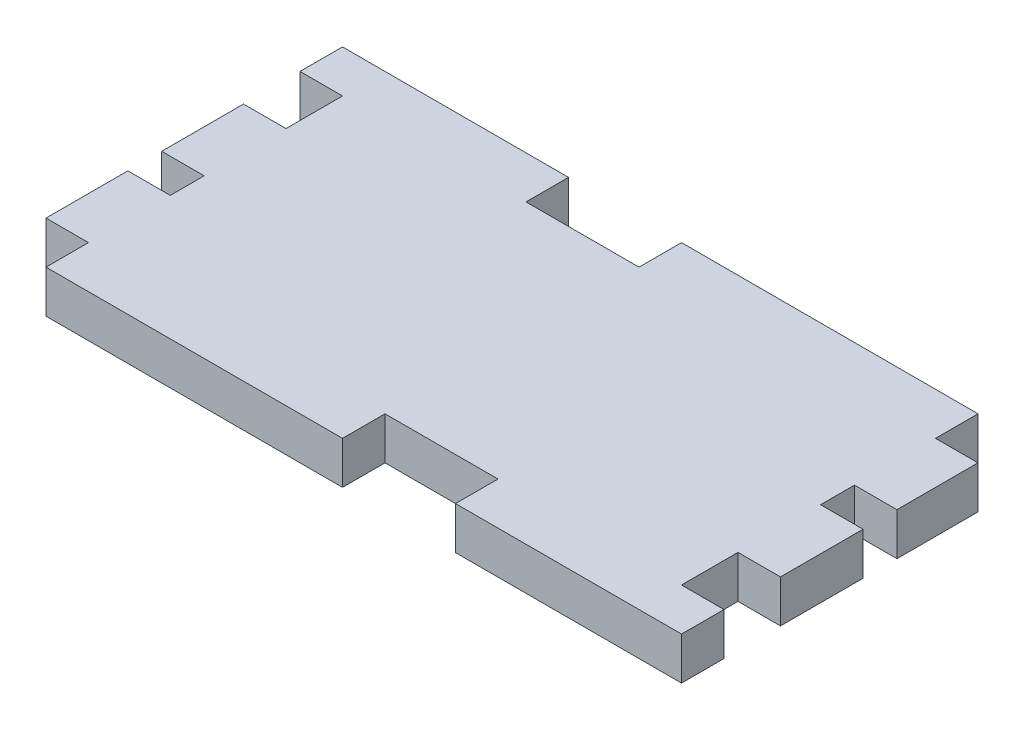
ISO-10303-21;
HEADER;
FILE_DESCRIPTION(('STEP AP214'),'2;1');
FILE_NAME('part.step','',(''),(''),'','','');
FILE_SCHEMA(('AUTOMOTIVE_DESIGN { 1 0 10303 214 1 1 1 1 }'));
ENDSEC;
DATA;
#1=APPLICATION_CONTEXT('core data for automotive mechanical design processes');
#2=APPLICATION_PROTOCOL_DEFINITION('international standard','automotive_design',2000,#1);
#3=PRODUCT_CONTEXT('',#1,'mechanical');
#4=PRODUCT('Part','Part','',(#3));
#5=PRODUCT_RELATED_PRODUCT_CATEGORY('part','',(#4));
#6=PRODUCT_DEFINITION_FORMATION('','',#4);
#7=PRODUCT_DEFINITION_CONTEXT('part definition',#1,'design');
#8=PRODUCT_DEFINITION('design','',#6,#7);
#9=PRODUCT_DEFINITION_SHAPE('','',#8);
#10=(LENGTH_UNIT() NAMED_UNIT(*) SI_UNIT(.MILLI.,.METRE.));
#11=(NAMED_UNIT(*) PLANE_ANGLE_UNIT() SI_UNIT($,.RADIAN.));
#12=(NAMED_UNIT(*) SI_UNIT($,.STERADIAN.) SOLID_ANGLE_UNIT());
#13=UNCERTAINTY_MEASURE_WITH_UNIT(LENGTH_MEASURE(1.E-05),#10,'distance_accuracy_value','');
#14=(GEOMETRIC_REPRESENTATION_CONTEXT(3) GLOBAL_UNCERTAINTY_ASSIGNED_CONTEXT((#13)) GLOBAL_UNIT_ASSIGNED_CONTEXT((#10,
#11,#12)) REPRESENTATION_CONTEXT('',''));
#15=CARTESIAN_POINT('',(0.,0.,0.));
#16=DIRECTION('',(0.,0.,1.));
#17=DIRECTION('',(1.,0.,0.));
#18=AXIS2_PLACEMENT_3D('',#15,#16,#17);
#19=CARTESIAN_POINT('',(38.1,4.7752,19.05));
#20=DIRECTION('',(-1.,0.,0.));
#21=DIRECTION('',(0.,0.,1.));
#22=AXIS2_PLACEMENT_3D('',#19,#20,#21);
#23=PLANE('',#22);
#24=DIRECTION('',(0.,0.,-1.));
#25=VECTOR('',#24,1.);
#26=CARTESIAN_POINT('',(38.1,0.,19.05));
#27=LINE('',#26,#25);
#28=CARTESIAN_POINT('',(38.1,0.,19.05));
#29=VERTEX_POINT('',#28);
#30=CARTESIAN_POINT('',(38.1,0.,14.2748));
#31=VERTEX_POINT('',#30);
#32=EDGE_CURVE('E293',#29,#31,#27,.T.);
#33=ORIENTED_EDGE('',*,*,#32,.T.);
#34=DIRECTION('',(0.,1.,0.));
#35=VECTOR('',#34,1.);
#36=CARTESIAN_POINT('',(38.1,-1.5748,14.2748));
#37=LINE('',#36,#35);
#38=CARTESIAN_POINT('',(38.1,4.7752,14.2748));
#39=VERTEX_POINT('',#38);
#40=EDGE_CURVE('E411',#31,#39,#37,.T.);
#41=ORIENTED_EDGE('',*,*,#40,.T.);
#42=DIRECTION('',(0.,0.,-1.));
#43=VECTOR('',#42,1.);
#44=CARTESIAN_POINT('',(38.1,4.7752,19.05));
#45=LINE('',#44,#43);
#46=CARTESIAN_POINT('',(38.1,4.7752,19.05));
#47=VERTEX_POINT('',#46);
#48=EDGE_CURVE('E285',#47,#39,#45,.T.);
#49=ORIENTED_EDGE('',*,*,#48,.F.);
#50=DIRECTION('',(0.,-1.,0.));
#51=VECTOR('',#50,1.);
#52=CARTESIAN_POINT('',(38.1,4.7752,19.05));
#53=LINE('',#52,#51);
#54=EDGE_CURVE('E309',#47,#29,#53,.T.);
#55=ORIENTED_EDGE('',*,*,#54,.T.);
#56=EDGE_LOOP('',(#33,#41,#49,#55));
#57=FACE_BOUND('',#56,.T.);
#58=ADVANCED_FACE('F43',(#57),#23,.F.);
#59=CARTESIAN_POINT('',(38.1,0.,-5.16420071734586));
#60=VERTEX_POINT('',#59);
#61=CARTESIAN_POINT('',(38.1,0.,-14.2748));
#62=VERTEX_POINT('',#61);
#63=EDGE_CURVE('E298',#60,#62,#27,.T.);
#64=ORIENTED_EDGE('',*,*,#63,.T.);
#65=DIRECTION('',(0.,1.,0.));
#66=VECTOR('',#65,1.);
#67=CARTESIAN_POINT('',(38.1,-1.5748,-14.2748));
#68=LINE('',#67,#66);
#69=CARTESIAN_POINT('',(38.1,4.7752,-14.2748));
#70=VERTEX_POINT('',#69);
#71=EDGE_CURVE('E263',#62,#70,#68,.T.);
#72=ORIENTED_EDGE('',*,*,#71,.T.);
#73=CARTESIAN_POINT('',(38.1,4.7752,-5.16420071734586));
#74=VERTEX_POINT('',#73);
#75=EDGE_CURVE('E576',#74,#70,#45,.T.);
#76=ORIENTED_EDGE('',*,*,#75,.F.);
#77=DIRECTION('',(0.,1.,0.));
#78=VECTOR('',#77,1.);
#79=CARTESIAN_POINT('',(38.1,-1.5748,-5.16420071734586));
#80=LINE('',#79,#78);
#81=EDGE_CURVE('E482',#60,#74,#80,.T.);
#82=ORIENTED_EDGE('',*,*,#81,.F.);
#83=EDGE_LOOP('',(#64,#72,#76,#82));
#84=FACE_BOUND('',#83,.T.);
#85=ADVANCED_FACE('F554',(#84),#23,.F.);
#86=CARTESIAN_POINT('',(-38.1,4.7752,-19.05));
#87=DIRECTION('',(0.,0.,1.));
#88=DIRECTION('',(1.,0.,0.));
#89=AXIS2_PLACEMENT_3D('',#86,#87,#88);
#90=PLANE('',#89);
#91=DIRECTION('',(-1.,0.,0.));
#92=VECTOR('',#91,1.);
#93=CARTESIAN_POINT('',(-38.1,0.,-19.05));
#94=LINE('',#93,#92);
#95=CARTESIAN_POINT('',(33.3248,0.,-19.05));
#96=VERTEX_POINT('',#95);
#97=CARTESIAN_POINT('',(0.,0.,-19.05));
#98=VERTEX_POINT('',#97);
#99=EDGE_CURVE('E300',#96,#98,#94,.T.);
#100=ORIENTED_EDGE('',*,*,#99,.T.);
#101=DIRECTION('',(0.,1.,0.));
#102=VECTOR('',#101,1.);
#103=CARTESIAN_POINT('',(0.,-1.5748,-19.05));
#104=LINE('',#103,#102);
#105=CARTESIAN_POINT('',(0.,4.7752,-19.05));
#106=VERTEX_POINT('',#105);
#107=EDGE_CURVE('E277',#98,#106,#104,.T.);
#108=ORIENTED_EDGE('',*,*,#107,.T.);
#109=DIRECTION('',(-1.,0.,0.));
#110=VECTOR('',#109,1.);
#111=CARTESIAN_POINT('',(-38.1,4.7752,-19.05));
#112=LINE('',#111,#110);
#113=CARTESIAN_POINT('',(33.3248,4.7752,-19.05));
#114=VERTEX_POINT('',#113);
#115=EDGE_CURVE('E270',#114,#106,#112,.T.);
#116=ORIENTED_EDGE('',*,*,#115,.F.);
#117=DIRECTION('',(0.,1.,0.));
#118=VECTOR('',#117,1.);
#119=CARTESIAN_POINT('',(33.3248,-1.5748,-19.05));
#120=LINE('',#119,#118);
#121=EDGE_CURVE('E251',#96,#114,#120,.T.);
#122=ORIENTED_EDGE('',*,*,#121,.F.);
#123=EDGE_LOOP('',(#100,#108,#116,#122));
#124=FACE_BOUND('',#123,.T.);
#125=ADVANCED_FACE('F276',(#124),#90,.F.);
#126=CARTESIAN_POINT('',(-38.1,4.7752,19.05));
#127=DIRECTION('',(1.,0.,0.));
#128=DIRECTION('',(0.,0.,-1.));
#129=AXIS2_PLACEMENT_3D('',#126,#127,#128);
#130=PLANE('',#129);
#131=DIRECTION('',(0.,0.,1.));
#132=VECTOR('',#131,1.);
#133=CARTESIAN_POINT('',(-38.1,0.,19.05));
#134=LINE('',#133,#132);
#135=CARTESIAN_POINT('',(-38.1,0.,-19.05));
#136=VERTEX_POINT('',#135);
#137=CARTESIAN_POINT('',(-38.1,0.,-14.2748));
#138=VERTEX_POINT('',#137);
#139=EDGE_CURVE('E301',#136,#138,#134,.T.);
#140=ORIENTED_EDGE('',*,*,#139,.T.);
#141=DIRECTION('',(0.,1.,0.));
#142=VECTOR('',#141,1.);
#143=CARTESIAN_POINT('',(-38.1,-1.5748,-14.2748));
#144=LINE('',#143,#142);
#145=CARTESIAN_POINT('',(-38.1,4.7752,-14.2748));
#146=VERTEX_POINT('',#145);
#147=EDGE_CURVE('E395',#138,#146,#144,.T.);
#148=ORIENTED_EDGE('',*,*,#147,.T.);
#149=DIRECTION('',(0.,0.,1.));
#150=VECTOR('',#149,1.);
#151=CARTESIAN_POINT('',(-38.1,4.7752,19.05));
#152=LINE('',#151,#150);
#153=CARTESIAN_POINT('',(-38.1,4.7752,-19.05));
#154=VERTEX_POINT('',#153);
#155=EDGE_CURVE('E284',#154,#146,#152,.T.);
#156=ORIENTED_EDGE('',*,*,#155,.F.);
#157=DIRECTION('',(0.,-1.,0.));
#158=VECTOR('',#157,1.);
#159=CARTESIAN_POINT('',(-38.1,4.7752,-19.05));
#160=LINE('',#159,#158);
#161=EDGE_CURVE('E312',#154,#136,#160,.T.);
#162=ORIENTED_EDGE('',*,*,#161,.T.);
#163=EDGE_LOOP('',(#140,#148,#156,#162));
#164=FACE_BOUND('',#163,.T.);
#165=ADVANCED_FACE('F774',(#164),#130,.F.);
#166=CARTESIAN_POINT('',(-38.1,4.7752,5.08));
#167=VERTEX_POINT('',#166);
#168=CARTESIAN_POINT('',(-38.1,4.7752,14.2748));
#169=VERTEX_POINT('',#168);
#170=EDGE_CURVE('E278',#167,#169,#152,.T.);
#171=ORIENTED_EDGE('',*,*,#170,.F.);
#172=DIRECTION('',(0.,1.,0.));
#173=VECTOR('',#172,1.);
#174=CARTESIAN_POINT('',(-38.1,-1.5748,5.08));
#175=LINE('',#174,#173);
#176=CARTESIAN_POINT('',(-38.1,0.,5.08));
#177=VERTEX_POINT('',#176);
#178=EDGE_CURVE('E427',#177,#167,#175,.T.);
#179=ORIENTED_EDGE('',*,*,#178,.F.);
#180=CARTESIAN_POINT('',(-38.1,0.,14.2748));
#181=VERTEX_POINT('',#180);
#182=EDGE_CURVE('E306',#177,#181,#134,.T.);
#183=ORIENTED_EDGE('',*,*,#182,.T.);
#184=DIRECTION('',(0.,1.,0.));
#185=VECTOR('',#184,1.);
#186=CARTESIAN_POINT('',(-38.1,-1.5748,14.2748));
#187=LINE('',#186,#185);
#188=EDGE_CURVE('E443',#181,#169,#187,.T.);
#189=ORIENTED_EDGE('',*,*,#188,.T.);
#190=EDGE_LOOP('',(#171,#179,#183,#189));
#191=FACE_BOUND('',#190,.T.);
#192=ADVANCED_FACE('F462',(#191),#130,.F.);
#193=CARTESIAN_POINT('',(-38.1,4.7752,19.05));
#194=DIRECTION('',(0.,0.,-1.));
#195=DIRECTION('',(-1.,0.,0.));
#196=AXIS2_PLACEMENT_3D('',#193,#194,#195);
#197=PLANE('',#196);
#198=DIRECTION('',(1.,0.,0.));
#199=VECTOR('',#198,1.);
#200=CARTESIAN_POINT('',(-38.1,0.,19.05));
#201=LINE('',#200,#199);
#202=CARTESIAN_POINT('',(-33.3248,0.,19.05));
#203=VERTEX_POINT('',#202);
#204=CARTESIAN_POINT('',(0.,0.,19.05));
#205=VERTEX_POINT('',#204);
#206=EDGE_CURVE('E308',#203,#205,#201,.T.);
#207=ORIENTED_EDGE('',*,*,#206,.T.);
#208=DIRECTION('',(0.,1.,0.));
#209=VECTOR('',#208,1.);
#210=CARTESIAN_POINT('',(0.,-1.5748,19.05));
#211=LINE('',#210,#209);
#212=CARTESIAN_POINT('',(0.,4.7752,19.05));
#213=VERTEX_POINT('',#212);
#214=EDGE_CURVE('E472',#205,#213,#211,.T.);
#215=ORIENTED_EDGE('',*,*,#214,.T.);
#216=DIRECTION('',(1.,0.,0.));
#217=VECTOR('',#216,1.);
#218=CARTESIAN_POINT('',(-38.1,4.7752,19.05));
#219=LINE('',#218,#217);
#220=CARTESIAN_POINT('',(-33.3248,4.7752,19.05));
#221=VERTEX_POINT('',#220);
#222=EDGE_CURVE('E292',#221,#213,#219,.T.);
#223=ORIENTED_EDGE('',*,*,#222,.F.);
#224=DIRECTION('',(0.,1.,0.));
#225=VECTOR('',#224,1.);
#226=CARTESIAN_POINT('',(-33.3248,-1.5748,19.05));
#227=LINE('',#226,#225);
#228=EDGE_CURVE('E441',#203,#221,#227,.T.);
#229=ORIENTED_EDGE('',*,*,#228,.F.);
#230=EDGE_LOOP('',(#207,#215,#223,#229));
#231=FACE_BOUND('',#230,.T.);
#232=ADVANCED_FACE('F470',(#231),#197,.F.);
#233=CARTESIAN_POINT('',(38.1,4.7752,7.92480000000001));
#234=VERTEX_POINT('',#233);
#235=CARTESIAN_POINT('',(38.1,4.7752,-1.35420071734586));
#236=VERTEX_POINT('',#235);
#237=EDGE_CURVE('E571',#234,#236,#45,.T.);
#238=ORIENTED_EDGE('',*,*,#237,.F.);
#239=DIRECTION('',(0.,1.,0.));
#240=VECTOR('',#239,1.);
#241=CARTESIAN_POINT('',(38.1,-1.5748,7.92480000000001));
#242=LINE('',#241,#240);
#243=CARTESIAN_POINT('',(38.1,0.,7.92480000000001));
#244=VERTEX_POINT('',#243);
#245=EDGE_CURVE('E404',#244,#234,#242,.T.);
#246=ORIENTED_EDGE('',*,*,#245,.F.);
#247=CARTESIAN_POINT('',(38.1,0.,-1.35420071734585));
#248=VERTEX_POINT('',#247);
#249=EDGE_CURVE('E297',#244,#248,#27,.T.);
#250=ORIENTED_EDGE('',*,*,#249,.T.);
#251=DIRECTION('',(0.,1.,0.));
#252=VECTOR('',#251,1.);
#253=CARTESIAN_POINT('',(38.1,-1.5748,-1.35420071734586));
#254=LINE('',#253,#252);
#255=EDGE_CURVE('E504',#248,#236,#254,.T.);
#256=ORIENTED_EDGE('',*,*,#255,.T.);
#257=EDGE_LOOP('',(#238,#246,#250,#256));
#258=FACE_BOUND('',#257,.T.);
#259=ADVANCED_FACE('F45',(#258),#23,.F.);
#260=CARTESIAN_POINT('',(-12.7,4.7752,-19.05));
#261=VERTEX_POINT('',#260);
#262=EDGE_CURVE('E279',#261,#154,#112,.T.);
#263=ORIENTED_EDGE('',*,*,#262,.F.);
#264=DIRECTION('',(0.,1.,0.));
#265=VECTOR('',#264,1.);
#266=CARTESIAN_POINT('',(-12.7,-1.5748,-19.05));
#267=LINE('',#266,#265);
#268=CARTESIAN_POINT('',(-12.7,0.,-19.05));
#269=VERTEX_POINT('',#268);
#270=EDGE_CURVE('E369',#269,#261,#267,.T.);
#271=ORIENTED_EDGE('',*,*,#270,.F.);
#272=EDGE_CURVE('E296',#269,#136,#94,.T.);
#273=ORIENTED_EDGE('',*,*,#272,.T.);
#274=ORIENTED_EDGE('',*,*,#161,.F.);
#275=EDGE_LOOP('',(#263,#271,#273,#274));
#276=FACE_BOUND('',#275,.T.);
#277=ADVANCED_FACE('F373',(#276),#90,.F.);
#278=CARTESIAN_POINT('',(-38.1,4.7752,-7.9248));
#279=VERTEX_POINT('',#278);
#280=CARTESIAN_POINT('',(-38.1,4.7752,1.27));
#281=VERTEX_POINT('',#280);
#282=EDGE_CURVE('E282',#279,#281,#152,.T.);
#283=ORIENTED_EDGE('',*,*,#282,.F.);
#284=DIRECTION('',(0.,1.,0.));
#285=VECTOR('',#284,1.);
#286=CARTESIAN_POINT('',(-38.1,-1.5748,-7.9248));
#287=LINE('',#286,#285);
#288=CARTESIAN_POINT('',(-38.1,0.,-7.9248));
#289=VERTEX_POINT('',#288);
#290=EDGE_CURVE('E389',#289,#279,#287,.T.);
#291=ORIENTED_EDGE('',*,*,#290,.F.);
#292=CARTESIAN_POINT('',(-38.1,0.,1.27000000000001));
#293=VERTEX_POINT('',#292);
#294=EDGE_CURVE('E305',#289,#293,#134,.T.);
#295=ORIENTED_EDGE('',*,*,#294,.T.);
#296=DIRECTION('',(0.,1.,0.));
#297=VECTOR('',#296,1.);
#298=CARTESIAN_POINT('',(-38.1,-1.5748,1.27));
#299=LINE('',#298,#297);
#300=EDGE_CURVE('E424',#293,#281,#299,.T.);
#301=ORIENTED_EDGE('',*,*,#300,.T.);
#302=EDGE_LOOP('',(#283,#291,#295,#301));
#303=FACE_BOUND('',#302,.T.);
#304=ADVANCED_FACE('F522',(#303),#130,.F.);
#305=CARTESIAN_POINT('',(12.7,4.7752,19.05));
#306=VERTEX_POINT('',#305);
#307=EDGE_CURVE('E290',#306,#47,#219,.T.);
#308=ORIENTED_EDGE('',*,*,#307,.F.);
#309=DIRECTION('',(0.,1.,0.));
#310=VECTOR('',#309,1.);
#311=CARTESIAN_POINT('',(12.7,-1.5748,19.05));
#312=LINE('',#311,#310);
#313=CARTESIAN_POINT('',(12.7,0.,19.05));
#314=VERTEX_POINT('',#313);
#315=EDGE_CURVE('E492',#314,#306,#312,.T.);
#316=ORIENTED_EDGE('',*,*,#315,.F.);
#317=EDGE_CURVE('E304',#314,#29,#201,.T.);
#318=ORIENTED_EDGE('',*,*,#317,.T.);
#319=ORIENTED_EDGE('',*,*,#54,.F.);
#320=EDGE_LOOP('',(#308,#316,#318,#319));
#321=FACE_BOUND('',#320,.T.);
#322=ADVANCED_FACE('F567',(#321),#197,.F.);
#323=CARTESIAN_POINT('',(0.,4.7752,0.));
#324=DIRECTION('',(0.,-1.,0.));
#325=DIRECTION('',(0.,0.,-1.));
#326=AXIS2_PLACEMENT_3D('',#323,#324,#325);
#327=PLANE('',#326);
#328=ORIENTED_EDGE('',*,*,#115,.T.);
#329=DIRECTION('',(0.,0.,-1.));
#330=VECTOR('',#329,1.);
#331=CARTESIAN_POINT('',(0.,4.7752,-14.2748));
#332=LINE('',#331,#330);
#333=CARTESIAN_POINT('',(0.,4.7752,-14.2748));
#334=VERTEX_POINT('',#333);
#335=EDGE_CURVE('E386',#334,#106,#332,.T.);
#336=ORIENTED_EDGE('',*,*,#335,.F.);
#337=DIRECTION('',(1.,0.,0.));
#338=VECTOR('',#337,1.);
#339=CARTESIAN_POINT('',(0.,4.7752,-14.2748));
#340=LINE('',#339,#338);
#341=CARTESIAN_POINT('',(-12.7,4.7752,-14.2748));
#342=VERTEX_POINT('',#341);
#343=EDGE_CURVE('E376',#342,#334,#340,.T.);
#344=ORIENTED_EDGE('',*,*,#343,.F.);
#345=DIRECTION('',(0.,0.,1.));
#346=VECTOR('',#345,1.);
#347=CARTESIAN_POINT('',(-12.7,4.7752,-14.2748));
#348=LINE('',#347,#346);
#349=EDGE_CURVE('E384',#261,#342,#348,.T.);
#350=ORIENTED_EDGE('',*,*,#349,.F.);
#351=ORIENTED_EDGE('',*,*,#262,.T.);
#352=ORIENTED_EDGE('',*,*,#155,.T.);
#353=DIRECTION('',(-1.,0.,0.));
#354=VECTOR('',#353,1.);
#355=CARTESIAN_POINT('',(-38.1,4.7752,-14.2748));
#356=LINE('',#355,#354);
#357=CARTESIAN_POINT('',(-33.3248,4.7752,-14.2748));
#358=VERTEX_POINT('',#357);
#359=EDGE_CURVE('E391',#358,#146,#356,.T.);
#360=ORIENTED_EDGE('',*,*,#359,.F.);
#361=DIRECTION('',(0.,0.,-1.));
#362=VECTOR('',#361,1.);
#363=CARTESIAN_POINT('',(-33.3248,4.7752,-14.2748));
#364=LINE('',#363,#362);
#365=CARTESIAN_POINT('',(-33.3248,4.7752,-7.9248));
#366=VERTEX_POINT('',#365);
#367=EDGE_CURVE('E400',#366,#358,#364,.T.);
#368=ORIENTED_EDGE('',*,*,#367,.F.);
#369=DIRECTION('',(1.,0.,0.));
#370=VECTOR('',#369,1.);
#371=CARTESIAN_POINT('',(-38.1,4.7752,-7.9248));
#372=LINE('',#371,#370);
#373=EDGE_CURVE('E382',#279,#366,#372,.T.);
#374=ORIENTED_EDGE('',*,*,#373,.F.);
#375=ORIENTED_EDGE('',*,*,#282,.T.);
#376=DIRECTION('',(-1.,0.,0.));
#377=VECTOR('',#376,1.);
#378=CARTESIAN_POINT('',(-38.1,4.7752,1.27));
#379=LINE('',#378,#377);
#380=CARTESIAN_POINT('',(-33.3248,4.7752,1.27));
#381=VERTEX_POINT('',#380);
#382=EDGE_CURVE('E432',#381,#281,#379,.T.);
#383=ORIENTED_EDGE('',*,*,#382,.F.);
#384=DIRECTION('',(0.,0.,-1.));
#385=VECTOR('',#384,1.);
#386=CARTESIAN_POINT('',(-33.3248,4.7752,5.08));
#387=LINE('',#386,#385);
#388=CARTESIAN_POINT('',(-33.3248,4.7752,5.08));
#389=VERTEX_POINT('',#388);
#390=EDGE_CURVE('E414',#389,#381,#387,.T.);
#391=ORIENTED_EDGE('',*,*,#390,.F.);
#392=DIRECTION('',(1.,0.,0.));
#393=VECTOR('',#392,1.);
#394=CARTESIAN_POINT('',(-38.1,4.7752,5.08));
#395=LINE('',#394,#393);
#396=EDGE_CURVE('E423',#167,#389,#395,.T.);
#397=ORIENTED_EDGE('',*,*,#396,.F.);
#398=ORIENTED_EDGE('',*,*,#170,.T.);
#399=DIRECTION('',(-1.,0.,0.));
#400=VECTOR('',#399,1.);
#401=CARTESIAN_POINT('',(-38.1,4.7752,14.2748));
#402=LINE('',#401,#400);
#403=CARTESIAN_POINT('',(-33.3248,4.7752,14.2748));
#404=VERTEX_POINT('',#403);
#405=EDGE_CURVE('E438',#404,#169,#402,.T.);
#406=ORIENTED_EDGE('',*,*,#405,.F.);
#407=DIRECTION('',(0.,0.,-1.));
#408=VECTOR('',#407,1.);
#409=CARTESIAN_POINT('',(-33.3248,4.7752,14.2748));
#410=LINE('',#409,#408);
#411=EDGE_CURVE('E388',#221,#404,#410,.T.);
#412=ORIENTED_EDGE('',*,*,#411,.F.);
#413=ORIENTED_EDGE('',*,*,#222,.T.);
#414=DIRECTION('',(0.,0.,1.));
#415=VECTOR('',#414,1.);
#416=CARTESIAN_POINT('',(0.,4.7752,14.2748));
#417=LINE('',#416,#415);
#418=CARTESIAN_POINT('',(0.,4.7752,14.2748));
#419=VERTEX_POINT('',#418);
#420=EDGE_CURVE('E475',#419,#213,#417,.T.);
#421=ORIENTED_EDGE('',*,*,#420,.F.);
#422=DIRECTION('',(-1.,0.,0.));
#423=VECTOR('',#422,1.);
#424=CARTESIAN_POINT('',(0.,4.7752,14.2748));
#425=LINE('',#424,#423);
#426=CARTESIAN_POINT('',(12.7,4.7752,14.2748));
#427=VERTEX_POINT('',#426);
#428=EDGE_CURVE('E478',#427,#419,#425,.T.);
#429=ORIENTED_EDGE('',*,*,#428,.F.);
#430=DIRECTION('',(0.,0.,-1.));
#431=VECTOR('',#430,1.);
#432=CARTESIAN_POINT('',(12.7,4.7752,14.2748));
#433=LINE('',#432,#431);
#434=EDGE_CURVE('E481',#306,#427,#433,.T.);
#435=ORIENTED_EDGE('',*,*,#434,.F.);
#436=ORIENTED_EDGE('',*,*,#307,.T.);
#437=ORIENTED_EDGE('',*,*,#48,.T.);
#438=DIRECTION('',(1.,0.,0.));
#439=VECTOR('',#438,1.);
#440=CARTESIAN_POINT('',(33.3248,4.7752,14.2748));
#441=LINE('',#440,#439);
#442=CARTESIAN_POINT('',(33.3248,4.7752,14.2748));
#443=VERTEX_POINT('',#442);
#444=EDGE_CURVE('E406',#443,#39,#441,.T.);
#445=ORIENTED_EDGE('',*,*,#444,.F.);
#446=DIRECTION('',(0.,0.,1.));
#447=VECTOR('',#446,1.);
#448=CARTESIAN_POINT('',(33.3248,4.7752,7.9248));
#449=LINE('',#448,#447);
#450=CARTESIAN_POINT('',(33.3248,4.7752,7.9248));
#451=VERTEX_POINT('',#450);
#452=EDGE_CURVE('E416',#451,#443,#449,.T.);
#453=ORIENTED_EDGE('',*,*,#452,.F.);
#454=DIRECTION('',(-1.,0.,0.));
#455=VECTOR('',#454,1.);
#456=CARTESIAN_POINT('',(33.3248,4.7752,7.9248));
#457=LINE('',#456,#455);
#458=EDGE_CURVE('E398',#234,#451,#457,.T.);
#459=ORIENTED_EDGE('',*,*,#458,.F.);
#460=ORIENTED_EDGE('',*,*,#237,.T.);
#461=DIRECTION('',(1.,0.,0.));
#462=VECTOR('',#461,1.);
#463=CARTESIAN_POINT('',(38.1,4.7752,-1.35420071734586));
#464=LINE('',#463,#462);
#465=CARTESIAN_POINT('',(33.3248,4.7752,-1.35420071734586));
#466=VERTEX_POINT('',#465);
#467=EDGE_CURVE('E497',#466,#236,#464,.T.);
#468=ORIENTED_EDGE('',*,*,#467,.F.);
#469=DIRECTION('',(0.,0.,1.));
#470=VECTOR('',#469,1.);
#471=CARTESIAN_POINT('',(33.3248,4.7752,-1.35420071734586));
#472=LINE('',#471,#470);
#473=CARTESIAN_POINT('',(33.3248,4.7752,-5.16420071734586));
#474=VERTEX_POINT('',#473);
#475=EDGE_CURVE('E264',#474,#466,#472,.T.);
#476=ORIENTED_EDGE('',*,*,#475,.F.);
#477=DIRECTION('',(-1.,0.,0.));
#478=VECTOR('',#477,1.);
#479=CARTESIAN_POINT('',(38.1,4.7752,-5.16420071734586));
#480=LINE('',#479,#478);
#481=EDGE_CURVE('E499',#74,#474,#480,.T.);
#482=ORIENTED_EDGE('',*,*,#481,.F.);
#483=ORIENTED_EDGE('',*,*,#75,.T.);
#484=DIRECTION('',(1.,0.,0.));
#485=VECTOR('',#484,1.);
#486=CARTESIAN_POINT('',(33.3248,4.7752,-14.2748));
#487=LINE('',#486,#485);
#488=CARTESIAN_POINT('',(33.3248,4.7752,-14.2748));
#489=VERTEX_POINT('',#488);
#490=EDGE_CURVE('E272',#489,#70,#487,.T.);
#491=ORIENTED_EDGE('',*,*,#490,.F.);
#492=DIRECTION('',(0.,0.,1.));
#493=VECTOR('',#492,1.);
#494=CARTESIAN_POINT('',(33.3248,4.7752,-19.05));
#495=LINE('',#494,#493);
#496=EDGE_CURVE('E255',#114,#489,#495,.T.);
#497=ORIENTED_EDGE('',*,*,#496,.F.);
#498=EDGE_LOOP('',(#328,#336,#344,#350,#351,#352,#360,#368,#374,#375,#383,#391,#397,#398,#406,
#412,#413,#421,#429,#435,#436,#437,#445,#453,#459,#460,#468,#476,#482,#483,#491,#497));
#499=FACE_BOUND('',#498,.T.);
#500=ADVANCED_FACE('F268',(#499),#327,.F.);
#501=CARTESIAN_POINT('',(0.,0.,0.));
#502=DIRECTION('',(0.,-1.,0.));
#503=DIRECTION('',(0.,0.,-1.));
#504=AXIS2_PLACEMENT_3D('',#501,#502,#503);
#505=PLANE('',#504);
#506=DIRECTION('',(0.,0.,1.));
#507=VECTOR('',#506,1.);
#508=CARTESIAN_POINT('',(0.,0.,0.));
#509=LINE('',#508,#507);
#510=CARTESIAN_POINT('',(0.,0.,-14.2748));
#511=VERTEX_POINT('',#510);
#512=EDGE_CURVE('E11',#98,#511,#509,.T.);
#513=ORIENTED_EDGE('',*,*,#512,.F.);
#514=ORIENTED_EDGE('',*,*,#99,.F.);
#515=DIRECTION('',(0.,0.,-1.));
#516=VECTOR('',#515,1.);
#517=CARTESIAN_POINT('',(33.3248,0.,0.));
#518=LINE('',#517,#516);
#519=CARTESIAN_POINT('',(33.3248,0.,-14.2748));
#520=VERTEX_POINT('',#519);
#521=EDGE_CURVE('E258',#520,#96,#518,.T.);
#522=ORIENTED_EDGE('',*,*,#521,.F.);
#523=DIRECTION('',(-1.,0.,0.));
#524=VECTOR('',#523,1.);
#525=CARTESIAN_POINT('',(0.,0.,-14.2748));
#526=LINE('',#525,#524);
#527=EDGE_CURVE('E332',#62,#520,#526,.T.);
#528=ORIENTED_EDGE('',*,*,#527,.F.);
#529=ORIENTED_EDGE('',*,*,#63,.F.);
#530=DIRECTION('',(1.,0.,0.));
#531=VECTOR('',#530,1.);
#532=CARTESIAN_POINT('',(0.,0.,-5.16420071734584));
#533=LINE('',#532,#531);
#534=CARTESIAN_POINT('',(33.3248,0.,-5.16420071734586));
#535=VERTEX_POINT('',#534);
#536=EDGE_CURVE('E330',#535,#60,#533,.T.);
#537=ORIENTED_EDGE('',*,*,#536,.F.);
#538=DIRECTION('',(0.,0.,-1.));
#539=VECTOR('',#538,1.);
#540=CARTESIAN_POINT('',(33.3248,0.,0.));
#541=LINE('',#540,#539);
#542=CARTESIAN_POINT('',(33.3248,0.,-1.35420071734586));
#543=VERTEX_POINT('',#542);
#544=EDGE_CURVE('E328',#543,#535,#541,.T.);
#545=ORIENTED_EDGE('',*,*,#544,.F.);
#546=DIRECTION('',(-1.,0.,0.));
#547=VECTOR('',#546,1.);
#548=CARTESIAN_POINT('',(0.,0.,-1.35420071734586));
#549=LINE('',#548,#547);
#550=EDGE_CURVE('E326',#248,#543,#549,.T.);
#551=ORIENTED_EDGE('',*,*,#550,.F.);
#552=ORIENTED_EDGE('',*,*,#249,.F.);
#553=DIRECTION('',(1.,0.,0.));
#554=VECTOR('',#553,1.);
#555=CARTESIAN_POINT('',(0.,0.,7.92479999999998));
#556=LINE('',#555,#554);
#557=CARTESIAN_POINT('',(33.3248,0.,7.9248));
#558=VERTEX_POINT('',#557);
#559=EDGE_CURVE('E341',#558,#244,#556,.T.);
#560=ORIENTED_EDGE('',*,*,#559,.F.);
#561=DIRECTION('',(0.,0.,-1.));
#562=VECTOR('',#561,1.);
#563=CARTESIAN_POINT('',(33.3248,0.,0.));
#564=LINE('',#563,#562);
#565=CARTESIAN_POINT('',(33.3248,0.,14.2748));
#566=VERTEX_POINT('',#565);
#567=EDGE_CURVE('E343',#566,#558,#564,.T.);
#568=ORIENTED_EDGE('',*,*,#567,.F.);
#569=DIRECTION('',(-1.,0.,0.));
#570=VECTOR('',#569,1.);
#571=CARTESIAN_POINT('',(0.,0.,14.2748));
#572=LINE('',#571,#570);
#573=EDGE_CURVE('E346',#31,#566,#572,.T.);
#574=ORIENTED_EDGE('',*,*,#573,.F.);
#575=ORIENTED_EDGE('',*,*,#32,.F.);
#576=ORIENTED_EDGE('',*,*,#317,.F.);
#577=DIRECTION('',(0.,0.,1.));
#578=VECTOR('',#577,1.);
#579=CARTESIAN_POINT('',(12.7,0.,0.));
#580=LINE('',#579,#578);
#581=CARTESIAN_POINT('',(12.7,0.,14.2748));
#582=VERTEX_POINT('',#581);
#583=EDGE_CURVE('E319',#582,#314,#580,.T.);
#584=ORIENTED_EDGE('',*,*,#583,.F.);
#585=DIRECTION('',(1.,0.,0.));
#586=VECTOR('',#585,1.);
#587=CARTESIAN_POINT('',(0.,0.,14.2748));
#588=LINE('',#587,#586);
#589=CARTESIAN_POINT('',(0.,0.,14.2748));
#590=VERTEX_POINT('',#589);
#591=EDGE_CURVE('E321',#590,#582,#588,.T.);
#592=ORIENTED_EDGE('',*,*,#591,.F.);
#593=DIRECTION('',(0.,0.,-1.));
#594=VECTOR('',#593,1.);
#595=CARTESIAN_POINT('',(0.,0.,0.));
#596=LINE('',#595,#594);
#597=EDGE_CURVE('E324',#205,#590,#596,.T.);
#598=ORIENTED_EDGE('',*,*,#597,.F.);
#599=ORIENTED_EDGE('',*,*,#206,.F.);
#600=DIRECTION('',(0.,0.,1.));
#601=VECTOR('',#600,1.);
#602=CARTESIAN_POINT('',(-33.3248,0.,0.));
#603=LINE('',#602,#601);
#604=CARTESIAN_POINT('',(-33.3248,0.,14.2748));
#605=VERTEX_POINT('',#604);
#606=EDGE_CURVE('E317',#605,#203,#603,.T.);
#607=ORIENTED_EDGE('',*,*,#606,.F.);
#608=DIRECTION('',(1.,0.,0.));
#609=VECTOR('',#608,1.);
#610=CARTESIAN_POINT('',(0.,0.,14.2748));
#611=LINE('',#610,#609);
#612=EDGE_CURVE('E315',#181,#605,#611,.T.);
#613=ORIENTED_EDGE('',*,*,#612,.F.);
#614=ORIENTED_EDGE('',*,*,#182,.F.);
#615=DIRECTION('',(-1.,0.,0.));
#616=VECTOR('',#615,1.);
#617=CARTESIAN_POINT('',(0.,0.,5.08));
#618=LINE('',#617,#616);
#619=CARTESIAN_POINT('',(-33.3248,0.,5.08));
#620=VERTEX_POINT('',#619);
#621=EDGE_CURVE('E339',#620,#177,#618,.T.);
#622=ORIENTED_EDGE('',*,*,#621,.F.);
#623=DIRECTION('',(0.,0.,1.));
#624=VECTOR('',#623,1.);
#625=CARTESIAN_POINT('',(-33.3248,0.,0.));
#626=LINE('',#625,#624);
#627=CARTESIAN_POINT('',(-33.3248,0.,1.27));
#628=VERTEX_POINT('',#627);
#629=EDGE_CURVE('E337',#628,#620,#626,.T.);
#630=ORIENTED_EDGE('',*,*,#629,.F.);
#631=DIRECTION('',(1.,0.,0.));
#632=VECTOR('',#631,1.);
#633=CARTESIAN_POINT('',(0.,0.,1.27));
#634=LINE('',#633,#632);
#635=EDGE_CURVE('E335',#293,#628,#634,.T.);
#636=ORIENTED_EDGE('',*,*,#635,.F.);
#637=ORIENTED_EDGE('',*,*,#294,.F.);
#638=DIRECTION('',(-1.,0.,0.));
#639=VECTOR('',#638,1.);
#640=CARTESIAN_POINT('',(0.,0.,-7.9248));
#641=LINE('',#640,#639);
#642=CARTESIAN_POINT('',(-33.3248,0.,-7.9248));
#643=VERTEX_POINT('',#642);
#644=EDGE_CURVE('E348',#643,#289,#641,.T.);
#645=ORIENTED_EDGE('',*,*,#644,.F.);
#646=DIRECTION('',(0.,0.,1.));
#647=VECTOR('',#646,1.);
#648=CARTESIAN_POINT('',(-33.3248,0.,0.));
#649=LINE('',#648,#647);
#650=CARTESIAN_POINT('',(-33.3248,0.,-14.2748));
#651=VERTEX_POINT('',#650);
#652=EDGE_CURVE('E350',#651,#643,#649,.T.);
#653=ORIENTED_EDGE('',*,*,#652,.F.);
#654=DIRECTION('',(1.,0.,0.));
#655=VECTOR('',#654,1.);
#656=CARTESIAN_POINT('',(0.,0.,-14.2748));
#657=LINE('',#656,#655);
#658=EDGE_CURVE('E352',#138,#651,#657,.T.);
#659=ORIENTED_EDGE('',*,*,#658,.F.);
#660=ORIENTED_EDGE('',*,*,#139,.F.);
#661=ORIENTED_EDGE('',*,*,#272,.F.);
#662=DIRECTION('',(0.,0.,-1.));
#663=VECTOR('',#662,1.);
#664=CARTESIAN_POINT('',(-12.7,0.,0.));
#665=LINE('',#664,#663);
#666=CARTESIAN_POINT('',(-12.7,0.,-14.2748));
#667=VERTEX_POINT('',#666);
#668=EDGE_CURVE('E354',#667,#269,#665,.T.);
#669=ORIENTED_EDGE('',*,*,#668,.F.);
#670=DIRECTION('',(-1.,0.,0.));
#671=VECTOR('',#670,1.);
#672=CARTESIAN_POINT('',(0.,0.,-14.2748));
#673=LINE('',#672,#671);
#674=EDGE_CURVE('E51',#511,#667,#673,.T.);
#675=ORIENTED_EDGE('',*,*,#674,.F.);
#676=EDGE_LOOP('',(#513,#514,#522,#528,#529,#537,#545,#551,#552,#560,#568,#574,#575,#576,#584,
#592,#598,#599,#607,#613,#614,#622,#630,#636,#637,#645,#653,#659,#660,#661,#669,#675));
#677=FACE_BOUND('',#676,.T.);
#678=ADVANCED_FACE('F365',(#677),#505,.T.);
#679=CARTESIAN_POINT('',(-33.3248,-1.5748,14.2748));
#680=DIRECTION('',(1.,0.,0.));
#681=DIRECTION('',(0.,0.,-1.));
#682=AXIS2_PLACEMENT_3D('',#679,#680,#681);
#683=PLANE('',#682);
#684=ORIENTED_EDGE('',*,*,#606,.T.);
#685=ORIENTED_EDGE('',*,*,#228,.T.);
#686=ORIENTED_EDGE('',*,*,#411,.T.);
#687=DIRECTION('',(0.,1.,0.));
#688=VECTOR('',#687,1.);
#689=CARTESIAN_POINT('',(-33.3248,-1.5748,14.2748));
#690=LINE('',#689,#688);
#691=EDGE_CURVE('E440',#605,#404,#690,.T.);
#692=ORIENTED_EDGE('',*,*,#691,.F.);
#693=EDGE_LOOP('',(#684,#685,#686,#692));
#694=FACE_BOUND('',#693,.T.);
#695=ADVANCED_FACE('F453',(#694),#683,.F.);
#696=CARTESIAN_POINT('',(-38.1,-1.5748,14.2748));
#697=DIRECTION('',(0.,0.,-1.));
#698=DIRECTION('',(-1.,0.,0.));
#699=AXIS2_PLACEMENT_3D('',#696,#697,#698);
#700=PLANE('',#699);
#701=ORIENTED_EDGE('',*,*,#612,.T.);
#702=ORIENTED_EDGE('',*,*,#691,.T.);
#703=ORIENTED_EDGE('',*,*,#405,.T.);
#704=ORIENTED_EDGE('',*,*,#188,.F.);
#705=EDGE_LOOP('',(#701,#702,#703,#704));
#706=FACE_BOUND('',#705,.T.);
#707=ADVANCED_FACE('F447',(#706),#700,.F.);
#708=CARTESIAN_POINT('',(0.,-1.5748,14.2748));
#709=DIRECTION('',(-1.,0.,0.));
#710=DIRECTION('',(0.,0.,1.));
#711=AXIS2_PLACEMENT_3D('',#708,#709,#710);
#712=PLANE('',#711);
#713=ORIENTED_EDGE('',*,*,#597,.T.);
#714=DIRECTION('',(0.,1.,0.));
#715=VECTOR('',#714,1.);
#716=CARTESIAN_POINT('',(0.,-1.5748,14.2748));
#717=LINE('',#716,#715);
#718=EDGE_CURVE('E488',#590,#419,#717,.T.);
#719=ORIENTED_EDGE('',*,*,#718,.T.);
#720=ORIENTED_EDGE('',*,*,#420,.T.);
#721=ORIENTED_EDGE('',*,*,#214,.F.);
#722=EDGE_LOOP('',(#713,#719,#720,#721));
#723=FACE_BOUND('',#722,.T.);
#724=ADVANCED_FACE('F605',(#723),#712,.F.);
#725=CARTESIAN_POINT('',(0.,-1.5748,14.2748));
#726=DIRECTION('',(0.,0.,-1.));
#727=DIRECTION('',(-1.,0.,0.));
#728=AXIS2_PLACEMENT_3D('',#725,#726,#727);
#729=PLANE('',#728);
#730=ORIENTED_EDGE('',*,*,#591,.T.);
#731=DIRECTION('',(0.,1.,0.));
#732=VECTOR('',#731,1.);
#733=CARTESIAN_POINT('',(12.7,-1.5748,14.2748));
#734=LINE('',#733,#732);
#735=EDGE_CURVE('E490',#582,#427,#734,.T.);
#736=ORIENTED_EDGE('',*,*,#735,.T.);
#737=ORIENTED_EDGE('',*,*,#428,.T.);
#738=ORIENTED_EDGE('',*,*,#718,.F.);
#739=EDGE_LOOP('',(#730,#736,#737,#738));
#740=FACE_BOUND('',#739,.T.);
#741=ADVANCED_FACE('F608',(#740),#729,.F.);
#742=CARTESIAN_POINT('',(12.7,-1.5748,14.2748));
#743=DIRECTION('',(1.,0.,0.));
#744=DIRECTION('',(0.,0.,-1.));
#745=AXIS2_PLACEMENT_3D('',#742,#743,#744);
#746=PLANE('',#745);
#747=ORIENTED_EDGE('',*,*,#583,.T.);
#748=ORIENTED_EDGE('',*,*,#315,.T.);
#749=ORIENTED_EDGE('',*,*,#434,.T.);
#750=ORIENTED_EDGE('',*,*,#735,.F.);
#751=EDGE_LOOP('',(#747,#748,#749,#750));
#752=FACE_BOUND('',#751,.T.);
#753=ADVANCED_FACE('F602',(#752),#746,.F.);
#754=CARTESIAN_POINT('',(33.3248,-1.5748,-1.35420071734586));
#755=DIRECTION('',(-1.,0.,0.));
#756=DIRECTION('',(0.,0.,1.));
#757=AXIS2_PLACEMENT_3D('',#754,#755,#756);
#758=PLANE('',#757);
#759=ORIENTED_EDGE('',*,*,#544,.T.);
#760=DIRECTION('',(0.,1.,0.));
#761=VECTOR('',#760,1.);
#762=CARTESIAN_POINT('',(33.3248,-1.5748,-5.16420071734586));
#763=LINE('',#762,#761);
#764=EDGE_CURVE('E480',#535,#474,#763,.T.);
#765=ORIENTED_EDGE('',*,*,#764,.T.);
#766=ORIENTED_EDGE('',*,*,#475,.T.);
#767=DIRECTION('',(0.,1.,0.));
#768=VECTOR('',#767,1.);
#769=CARTESIAN_POINT('',(33.3248,-1.5748,-1.35420071734586));
#770=LINE('',#769,#768);
#771=EDGE_CURVE('E501',#543,#466,#770,.T.);
#772=ORIENTED_EDGE('',*,*,#771,.F.);
#773=EDGE_LOOP('',(#759,#765,#766,#772));
#774=FACE_BOUND('',#773,.T.);
#775=ADVANCED_FACE('F591',(#774),#758,.F.);
#776=CARTESIAN_POINT('',(38.1,-1.5748,-5.16420071734586));
#777=DIRECTION('',(0.,0.,-1.));
#778=DIRECTION('',(-1.,0.,0.));
#779=AXIS2_PLACEMENT_3D('',#776,#777,#778);
#780=PLANE('',#779);
#781=ORIENTED_EDGE('',*,*,#536,.T.);
#782=ORIENTED_EDGE('',*,*,#81,.T.);
#783=ORIENTED_EDGE('',*,*,#481,.T.);
#784=ORIENTED_EDGE('',*,*,#764,.F.);
#785=EDGE_LOOP('',(#781,#782,#783,#784));
#786=FACE_BOUND('',#785,.T.);
#787=ADVANCED_FACE('F594',(#786),#780,.F.);
#788=CARTESIAN_POINT('',(38.1,-1.5748,-1.35420071734586));
#789=DIRECTION('',(0.,0.,1.));
#790=DIRECTION('',(1.,0.,0.));
#791=AXIS2_PLACEMENT_3D('',#788,#789,#790);
#792=PLANE('',#791);
#793=ORIENTED_EDGE('',*,*,#550,.T.);
#794=ORIENTED_EDGE('',*,*,#771,.T.);
#795=ORIENTED_EDGE('',*,*,#467,.T.);
#796=ORIENTED_EDGE('',*,*,#255,.F.);
#797=EDGE_LOOP('',(#793,#794,#795,#796));
#798=FACE_BOUND('',#797,.T.);
#799=ADVANCED_FACE('F589',(#798),#792,.F.);
#800=CARTESIAN_POINT('',(33.3248,-1.5748,-19.05));
#801=DIRECTION('',(-1.,0.,0.));
#802=DIRECTION('',(0.,0.,1.));
#803=AXIS2_PLACEMENT_3D('',#800,#801,#802);
#804=PLANE('',#803);
#805=ORIENTED_EDGE('',*,*,#521,.T.);
#806=ORIENTED_EDGE('',*,*,#121,.T.);
#807=ORIENTED_EDGE('',*,*,#496,.T.);
#808=DIRECTION('',(0.,1.,0.));
#809=VECTOR('',#808,1.);
#810=CARTESIAN_POINT('',(33.3248,-1.5748,-14.2748));
#811=LINE('',#810,#809);
#812=EDGE_CURVE('E508',#520,#489,#811,.T.);
#813=ORIENTED_EDGE('',*,*,#812,.F.);
#814=EDGE_LOOP('',(#805,#806,#807,#813));
#815=FACE_BOUND('',#814,.T.);
#816=ADVANCED_FACE('F253',(#815),#804,.F.);
#817=CARTESIAN_POINT('',(33.3248,-1.5748,-14.2748));
#818=DIRECTION('',(0.,0.,1.));
#819=DIRECTION('',(1.,0.,0.));
#820=AXIS2_PLACEMENT_3D('',#817,#818,#819);
#821=PLANE('',#820);
#822=ORIENTED_EDGE('',*,*,#527,.T.);
#823=ORIENTED_EDGE('',*,*,#812,.T.);
#824=ORIENTED_EDGE('',*,*,#490,.T.);
#825=ORIENTED_EDGE('',*,*,#71,.F.);
#826=EDGE_LOOP('',(#822,#823,#824,#825));
#827=FACE_BOUND('',#826,.T.);
#828=ADVANCED_FACE('F513',(#827),#821,.F.);
#829=CARTESIAN_POINT('',(-33.3248,-1.5748,5.08));
#830=DIRECTION('',(1.,0.,0.));
#831=DIRECTION('',(0.,0.,-1.));
#832=AXIS2_PLACEMENT_3D('',#829,#830,#831);
#833=PLANE('',#832);
#834=ORIENTED_EDGE('',*,*,#629,.T.);
#835=DIRECTION('',(0.,1.,0.));
#836=VECTOR('',#835,1.);
#837=CARTESIAN_POINT('',(-33.3248,-1.5748,5.08));
#838=LINE('',#837,#836);
#839=EDGE_CURVE('E273',#620,#389,#838,.T.);
#840=ORIENTED_EDGE('',*,*,#839,.T.);
#841=ORIENTED_EDGE('',*,*,#390,.T.);
#842=DIRECTION('',(0.,1.,0.));
#843=VECTOR('',#842,1.);
#844=CARTESIAN_POINT('',(-33.3248,-1.5748,1.27));
#845=LINE('',#844,#843);
#846=EDGE_CURVE('E421',#628,#381,#845,.T.);
#847=ORIENTED_EDGE('',*,*,#846,.F.);
#848=EDGE_LOOP('',(#834,#840,#841,#847));
#849=FACE_BOUND('',#848,.T.);
#850=ADVANCED_FACE('F532',(#849),#833,.F.);
#851=CARTESIAN_POINT('',(-38.1,-1.5748,5.08));
#852=DIRECTION('',(0.,0.,1.));
#853=DIRECTION('',(1.,0.,0.));
#854=AXIS2_PLACEMENT_3D('',#851,#852,#853);
#855=PLANE('',#854);
#856=ORIENTED_EDGE('',*,*,#621,.T.);
#857=ORIENTED_EDGE('',*,*,#178,.T.);
#858=ORIENTED_EDGE('',*,*,#396,.T.);
#859=ORIENTED_EDGE('',*,*,#839,.F.);
#860=EDGE_LOOP('',(#856,#857,#858,#859));
#861=FACE_BOUND('',#860,.T.);
#862=ADVANCED_FACE('F684',(#861),#855,.F.);
#863=CARTESIAN_POINT('',(-38.1,-1.5748,1.27));
#864=DIRECTION('',(0.,0.,-1.));
#865=DIRECTION('',(-1.,0.,0.));
#866=AXIS2_PLACEMENT_3D('',#863,#864,#865);
#867=PLANE('',#866);
#868=ORIENTED_EDGE('',*,*,#635,.T.);
#869=ORIENTED_EDGE('',*,*,#846,.T.);
#870=ORIENTED_EDGE('',*,*,#382,.T.);
#871=ORIENTED_EDGE('',*,*,#300,.F.);
#872=EDGE_LOOP('',(#868,#869,#870,#871));
#873=FACE_BOUND('',#872,.T.);
#874=ADVANCED_FACE('F530',(#873),#867,.F.);
#875=CARTESIAN_POINT('',(33.3248,-1.5748,14.2748));
#876=DIRECTION('',(0.,0.,1.));
#877=DIRECTION('',(1.,0.,0.));
#878=AXIS2_PLACEMENT_3D('',#875,#876,#877);
#879=PLANE('',#878);
#880=ORIENTED_EDGE('',*,*,#573,.T.);
#881=DIRECTION('',(0.,1.,0.));
#882=VECTOR('',#881,1.);
#883=CARTESIAN_POINT('',(33.3248,-1.5748,14.2748));
#884=LINE('',#883,#882);
#885=EDGE_CURVE('E409',#566,#443,#884,.T.);
#886=ORIENTED_EDGE('',*,*,#885,.T.);
#887=ORIENTED_EDGE('',*,*,#444,.T.);
#888=ORIENTED_EDGE('',*,*,#40,.F.);
#889=EDGE_LOOP('',(#880,#886,#887,#888));
#890=FACE_BOUND('',#889,.T.);
#891=ADVANCED_FACE('F667',(#890),#879,.F.);
#892=CARTESIAN_POINT('',(33.3248,-1.5748,7.9248));
#893=DIRECTION('',(-1.,0.,0.));
#894=DIRECTION('',(0.,0.,1.));
#895=AXIS2_PLACEMENT_3D('',#892,#893,#894);
#896=PLANE('',#895);
#897=ORIENTED_EDGE('',*,*,#567,.T.);
#898=DIRECTION('',(0.,1.,0.));
#899=VECTOR('',#898,1.);
#900=CARTESIAN_POINT('',(33.3248,-1.5748,7.9248));
#901=LINE('',#900,#899);
#902=EDGE_CURVE('E407',#558,#451,#901,.T.);
#903=ORIENTED_EDGE('',*,*,#902,.T.);
#904=ORIENTED_EDGE('',*,*,#452,.T.);
#905=ORIENTED_EDGE('',*,*,#885,.F.);
#906=EDGE_LOOP('',(#897,#903,#904,#905));
#907=FACE_BOUND('',#906,.T.);
#908=ADVANCED_FACE('F658',(#907),#896,.F.);
#909=CARTESIAN_POINT('',(33.3248,-1.5748,7.9248));
#910=DIRECTION('',(0.,0.,-1.));
#911=DIRECTION('',(-1.,0.,0.));
#912=AXIS2_PLACEMENT_3D('',#909,#910,#911);
#913=PLANE('',#912);
#914=ORIENTED_EDGE('',*,*,#559,.T.);
#915=ORIENTED_EDGE('',*,*,#245,.T.);
#916=ORIENTED_EDGE('',*,*,#458,.T.);
#917=ORIENTED_EDGE('',*,*,#902,.F.);
#918=EDGE_LOOP('',(#914,#915,#916,#917));
#919=FACE_BOUND('',#918,.T.);
#920=ADVANCED_FACE('F649',(#919),#913,.F.);
#921=CARTESIAN_POINT('',(-38.1,-1.5748,-14.2748));
#922=DIRECTION('',(0.,0.,-1.));
#923=DIRECTION('',(-1.,0.,0.));
#924=AXIS2_PLACEMENT_3D('',#921,#922,#923);
#925=PLANE('',#924);
#926=ORIENTED_EDGE('',*,*,#658,.T.);
#927=DIRECTION('',(0.,1.,0.));
#928=VECTOR('',#927,1.);
#929=CARTESIAN_POINT('',(-33.3248,-1.5748,-14.2748));
#930=LINE('',#929,#928);
#931=EDGE_CURVE('E393',#651,#358,#930,.T.);
#932=ORIENTED_EDGE('',*,*,#931,.T.);
#933=ORIENTED_EDGE('',*,*,#359,.T.);
#934=ORIENTED_EDGE('',*,*,#147,.F.);
#935=EDGE_LOOP('',(#926,#932,#933,#934));
#936=FACE_BOUND('',#935,.T.);
#937=ADVANCED_FACE('F549',(#936),#925,.F.);
#938=CARTESIAN_POINT('',(-33.3248,-1.5748,-14.2748));
#939=DIRECTION('',(1.,0.,0.));
#940=DIRECTION('',(0.,0.,-1.));
#941=AXIS2_PLACEMENT_3D('',#938,#939,#940);
#942=PLANE('',#941);
#943=ORIENTED_EDGE('',*,*,#652,.T.);
#944=DIRECTION('',(0.,1.,0.));
#945=VECTOR('',#944,1.);
#946=CARTESIAN_POINT('',(-33.3248,-1.5748,-7.9248));
#947=LINE('',#946,#945);
#948=EDGE_CURVE('E66',#643,#366,#947,.T.);
#949=ORIENTED_EDGE('',*,*,#948,.T.);
#950=ORIENTED_EDGE('',*,*,#367,.T.);
#951=ORIENTED_EDGE('',*,*,#931,.F.);
#952=EDGE_LOOP('',(#943,#949,#950,#951));
#953=FACE_BOUND('',#952,.T.);
#954=ADVANCED_FACE('F541',(#953),#942,.F.);
#955=CARTESIAN_POINT('',(-38.1,-1.5748,-7.9248));
#956=DIRECTION('',(0.,0.,1.));
#957=DIRECTION('',(1.,0.,0.));
#958=AXIS2_PLACEMENT_3D('',#955,#956,#957);
#959=PLANE('',#958);
#960=ORIENTED_EDGE('',*,*,#644,.T.);
#961=ORIENTED_EDGE('',*,*,#290,.T.);
#962=ORIENTED_EDGE('',*,*,#373,.T.);
#963=ORIENTED_EDGE('',*,*,#948,.F.);
#964=EDGE_LOOP('',(#960,#961,#962,#963));
#965=FACE_BOUND('',#964,.T.);
#966=ADVANCED_FACE('F538',(#965),#959,.F.);
#967=CARTESIAN_POINT('',(0.,-1.5748,-14.2748));
#968=DIRECTION('',(1.,0.,0.));
#969=DIRECTION('',(0.,0.,-1.));
#970=AXIS2_PLACEMENT_3D('',#967,#968,#969);
#971=PLANE('',#970);
#972=ORIENTED_EDGE('',*,*,#512,.T.);
#973=DIRECTION('',(0.,1.,0.));
#974=VECTOR('',#973,1.);
#975=CARTESIAN_POINT('',(0.,-1.5748,-14.2748));
#976=LINE('',#975,#974);
#977=EDGE_CURVE('E361',#511,#334,#976,.T.);
#978=ORIENTED_EDGE('',*,*,#977,.T.);
#979=ORIENTED_EDGE('',*,*,#335,.T.);
#980=ORIENTED_EDGE('',*,*,#107,.F.);
#981=EDGE_LOOP('',(#972,#978,#979,#980));
#982=FACE_BOUND('',#981,.T.);
#983=ADVANCED_FACE('F540',(#982),#971,.F.);
#984=CARTESIAN_POINT('',(0.,-1.5748,-14.2748));
#985=DIRECTION('',(0.,0.,1.));
#986=DIRECTION('',(1.,0.,0.));
#987=AXIS2_PLACEMENT_3D('',#984,#985,#986);
#988=PLANE('',#987);
#989=ORIENTED_EDGE('',*,*,#674,.T.);
#990=DIRECTION('',(0.,1.,0.));
#991=VECTOR('',#990,1.);
#992=CARTESIAN_POINT('',(-12.7,-1.5748,-14.2748));
#993=LINE('',#992,#991);
#994=EDGE_CURVE('E58',#667,#342,#993,.T.);
#995=ORIENTED_EDGE('',*,*,#994,.T.);
#996=ORIENTED_EDGE('',*,*,#343,.T.);
#997=ORIENTED_EDGE('',*,*,#977,.F.);
#998=EDGE_LOOP('',(#989,#995,#996,#997));
#999=FACE_BOUND('',#998,.T.);
#1000=ADVANCED_FACE('F359',(#999),#988,.F.);
#1001=CARTESIAN_POINT('',(-12.7,-1.5748,-14.2748));
#1002=DIRECTION('',(-1.,0.,0.));
#1003=DIRECTION('',(0.,0.,1.));
#1004=AXIS2_PLACEMENT_3D('',#1001,#1002,#1003);
#1005=PLANE('',#1004);
#1006=ORIENTED_EDGE('',*,*,#668,.T.);
#1007=ORIENTED_EDGE('',*,*,#270,.T.);
#1008=ORIENTED_EDGE('',*,*,#349,.T.);
#1009=ORIENTED_EDGE('',*,*,#994,.F.);
#1010=EDGE_LOOP('',(#1006,#1007,#1008,#1009));
#1011=FACE_BOUND('',#1010,.T.);
#1012=ADVANCED_FACE('F368',(#1011),#1005,.F.);
#1013=CLOSED_SHELL('',(#58,#85,#125,#165,#192,#232,#259,#277,#304,#322,#500,#678,#695,#707,#724,
#741,#753,#775,#787,#799,#816,#828,#850,#862,#874,#891,#908,#920,#937,#954,#966,#983,#1000,#1012));
#1014=MANIFOLD_SOLID_BREP('B2',#1013);
#1015=ADVANCED_BREP_SHAPE_REPRESENTATION('',(#18,#1014),#14);
#1016=SHAPE_DEFINITION_REPRESENTATION(#9,#1015);
ENDSEC;
END-ISO-10303-21;
